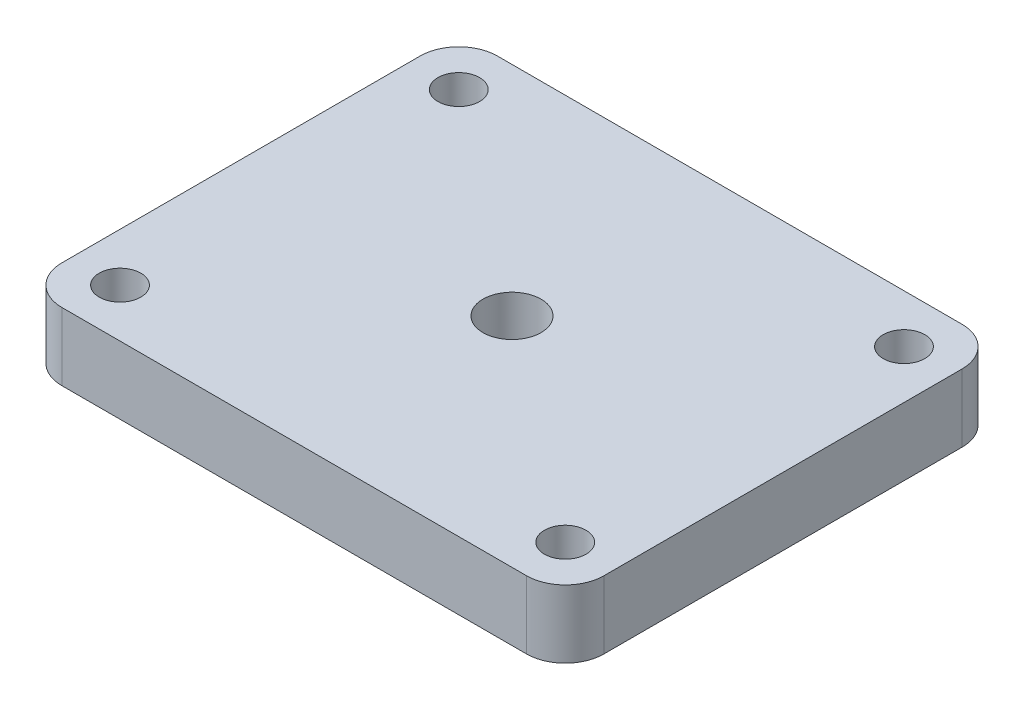
ISO-10303-21;
HEADER;
FILE_DESCRIPTION(('STEP AP214'),'2;1');
FILE_NAME('part.step','',(''),(''),'','','');
FILE_SCHEMA(('AUTOMOTIVE_DESIGN { 1 0 10303 214 1 1 1 1 }'));
ENDSEC;
DATA;
#1=APPLICATION_CONTEXT('core data for automotive mechanical design processes');
#2=APPLICATION_PROTOCOL_DEFINITION('international standard','automotive_design',2000,#1);
#3=PRODUCT_CONTEXT('',#1,'mechanical');
#4=PRODUCT('Part','Part','',(#3));
#5=PRODUCT_RELATED_PRODUCT_CATEGORY('part','',(#4));
#6=PRODUCT_DEFINITION_FORMATION('','',#4);
#7=PRODUCT_DEFINITION_CONTEXT('part definition',#1,'design');
#8=PRODUCT_DEFINITION('design','',#6,#7);
#9=PRODUCT_DEFINITION_SHAPE('','',#8);
#10=(LENGTH_UNIT() NAMED_UNIT(*) SI_UNIT(.MILLI.,.METRE.));
#11=(NAMED_UNIT(*) PLANE_ANGLE_UNIT() SI_UNIT($,.RADIAN.));
#12=(NAMED_UNIT(*) SI_UNIT($,.STERADIAN.) SOLID_ANGLE_UNIT());
#13=UNCERTAINTY_MEASURE_WITH_UNIT(LENGTH_MEASURE(1.E-05),#10,'distance_accuracy_value','');
#14=(GEOMETRIC_REPRESENTATION_CONTEXT(3) GLOBAL_UNCERTAINTY_ASSIGNED_CONTEXT((#13)) GLOBAL_UNIT_ASSIGNED_CONTEXT((#10,
#11,#12)) REPRESENTATION_CONTEXT('',''));
#15=CARTESIAN_POINT('',(0.,0.,0.));
#16=DIRECTION('',(0.,0.,1.));
#17=DIRECTION('',(1.,0.,0.));
#18=AXIS2_PLACEMENT_3D('',#15,#16,#17);
#19=CARTESIAN_POINT('',(24.,1.,-18.5));
#20=DIRECTION('',(0.,-1.,0.));
#21=DIRECTION('',(0.,0.,-1.));
#22=AXIS2_PLACEMENT_3D('',#19,#20,#21);
#23=CYLINDRICAL_SURFACE('',#22,4.);
#24=DIRECTION('',(0.,-1.,0.));
#25=VECTOR('',#24,1.);
#26=CARTESIAN_POINT('',(28.,1.,-18.5));
#27=LINE('',#26,#25);
#28=CARTESIAN_POINT('',(28.,1.,-18.5));
#29=VERTEX_POINT('',#28);
#30=CARTESIAN_POINT('',(28.,-6.,-18.5));
#31=VERTEX_POINT('',#30);
#32=EDGE_CURVE('E177',#29,#31,#27,.T.);
#33=ORIENTED_EDGE('',*,*,#32,.T.);
#34=CARTESIAN_POINT('',(24.,-6.,-18.5));
#35=DIRECTION('',(0.,-1.,0.));
#36=DIRECTION('',(0.,0.,-1.));
#37=AXIS2_PLACEMENT_3D('',#34,#35,#36);
#38=CIRCLE('',#37,4.);
#39=CARTESIAN_POINT('',(24.,-6.,-22.5));
#40=VERTEX_POINT('',#39);
#41=EDGE_CURVE('E116',#40,#31,#38,.T.);
#42=ORIENTED_EDGE('',*,*,#41,.F.);
#43=DIRECTION('',(0.,-1.,0.));
#44=VECTOR('',#43,1.);
#45=CARTESIAN_POINT('',(24.,1.,-22.5));
#46=LINE('',#45,#44);
#47=CARTESIAN_POINT('',(24.,1.,-22.5));
#48=VERTEX_POINT('',#47);
#49=EDGE_CURVE('E11',#48,#40,#46,.T.);
#50=ORIENTED_EDGE('',*,*,#49,.F.);
#51=CARTESIAN_POINT('',(24.,1.,-18.5));
#52=DIRECTION('',(0.,1.,0.));
#53=DIRECTION('',(0.,0.,1.));
#54=AXIS2_PLACEMENT_3D('',#51,#52,#53);
#55=CIRCLE('',#54,4.);
#56=EDGE_CURVE('E153',#48,#29,#55,.F.);
#57=ORIENTED_EDGE('',*,*,#56,.T.);
#58=EDGE_LOOP('',(#33,#42,#50,#57));
#59=FACE_BOUND('',#58,.T.);
#60=ADVANCED_FACE('F38',(#59),#23,.T.);
#61=CARTESIAN_POINT('',(0.,1.,-22.5));
#62=DIRECTION('',(0.,0.,-1.));
#63=DIRECTION('',(-1.,0.,0.));
#64=AXIS2_PLACEMENT_3D('',#61,#62,#63);
#65=PLANE('',#64);
#66=ORIENTED_EDGE('',*,*,#49,.T.);
#67=DIRECTION('',(1.,0.,0.));
#68=VECTOR('',#67,1.);
#69=CARTESIAN_POINT('',(-24.,-6.,-22.5));
#70=LINE('',#69,#68);
#71=CARTESIAN_POINT('',(-24.,-6.,-22.5));
#72=VERTEX_POINT('',#71);
#73=EDGE_CURVE('E111',#72,#40,#70,.T.);
#74=ORIENTED_EDGE('',*,*,#73,.F.);
#75=DIRECTION('',(0.,-1.,0.));
#76=VECTOR('',#75,1.);
#77=CARTESIAN_POINT('',(-24.,1.,-22.5));
#78=LINE('',#77,#76);
#79=CARTESIAN_POINT('',(-24.,1.,-22.5));
#80=VERTEX_POINT('',#79);
#81=EDGE_CURVE('E46',#80,#72,#78,.T.);
#82=ORIENTED_EDGE('',*,*,#81,.F.);
#83=DIRECTION('',(1.,0.,0.));
#84=VECTOR('',#83,1.);
#85=CARTESIAN_POINT('',(0.,1.,-22.5));
#86=LINE('',#85,#84);
#87=EDGE_CURVE('E156',#80,#48,#86,.T.);
#88=ORIENTED_EDGE('',*,*,#87,.T.);
#89=EDGE_LOOP('',(#66,#74,#82,#88));
#90=FACE_BOUND('',#89,.T.);
#91=ADVANCED_FACE('F112',(#90),#65,.T.);
#92=CARTESIAN_POINT('',(-24.,1.,-18.5));
#93=DIRECTION('',(0.,-1.,0.));
#94=DIRECTION('',(0.,0.,-1.));
#95=AXIS2_PLACEMENT_3D('',#92,#93,#94);
#96=CYLINDRICAL_SURFACE('',#95,4.);
#97=ORIENTED_EDGE('',*,*,#81,.T.);
#98=CARTESIAN_POINT('',(-24.,-6.,-18.5));
#99=DIRECTION('',(0.,-1.,0.));
#100=DIRECTION('',(0.,0.,-1.));
#101=AXIS2_PLACEMENT_3D('',#98,#99,#100);
#102=CIRCLE('',#101,4.);
#103=CARTESIAN_POINT('',(-28.,-6.,-18.5));
#104=VERTEX_POINT('',#103);
#105=EDGE_CURVE('E103',#104,#72,#102,.T.);
#106=ORIENTED_EDGE('',*,*,#105,.F.);
#107=DIRECTION('',(0.,-1.,0.));
#108=VECTOR('',#107,1.);
#109=CARTESIAN_POINT('',(-28.,1.,-18.5));
#110=LINE('',#109,#108);
#111=CARTESIAN_POINT('',(-28.,1.,-18.5));
#112=VERTEX_POINT('',#111);
#113=EDGE_CURVE('E109',#112,#104,#110,.T.);
#114=ORIENTED_EDGE('',*,*,#113,.F.);
#115=CARTESIAN_POINT('',(-24.,1.,-18.5));
#116=DIRECTION('',(0.,1.,0.));
#117=DIRECTION('',(0.,0.,1.));
#118=AXIS2_PLACEMENT_3D('',#115,#116,#117);
#119=CIRCLE('',#118,4.);
#120=EDGE_CURVE('E105',#112,#80,#119,.F.);
#121=ORIENTED_EDGE('',*,*,#120,.T.);
#122=EDGE_LOOP('',(#97,#106,#114,#121));
#123=FACE_BOUND('',#122,.T.);
#124=ADVANCED_FACE('F101',(#123),#96,.T.);
#125=CARTESIAN_POINT('',(-28.,1.,0.));
#126=DIRECTION('',(-1.,0.,0.));
#127=DIRECTION('',(0.,0.,1.));
#128=AXIS2_PLACEMENT_3D('',#125,#126,#127);
#129=PLANE('',#128);
#130=ORIENTED_EDGE('',*,*,#113,.T.);
#131=DIRECTION('',(0.,0.,-1.));
#132=VECTOR('',#131,1.);
#133=CARTESIAN_POINT('',(-28.,-6.,18.5));
#134=LINE('',#133,#132);
#135=CARTESIAN_POINT('',(-28.,-6.,18.5));
#136=VERTEX_POINT('',#135);
#137=EDGE_CURVE('E123',#136,#104,#134,.T.);
#138=ORIENTED_EDGE('',*,*,#137,.F.);
#139=DIRECTION('',(0.,-1.,0.));
#140=VECTOR('',#139,1.);
#141=CARTESIAN_POINT('',(-28.,1.,18.5));
#142=LINE('',#141,#140);
#143=CARTESIAN_POINT('',(-28.,1.,18.5));
#144=VERTEX_POINT('',#143);
#145=EDGE_CURVE('E185',#144,#136,#142,.T.);
#146=ORIENTED_EDGE('',*,*,#145,.F.);
#147=DIRECTION('',(0.,0.,-1.));
#148=VECTOR('',#147,1.);
#149=CARTESIAN_POINT('',(-28.,1.,0.));
#150=LINE('',#149,#148);
#151=EDGE_CURVE('E159',#144,#112,#150,.T.);
#152=ORIENTED_EDGE('',*,*,#151,.T.);
#153=EDGE_LOOP('',(#130,#138,#146,#152));
#154=FACE_BOUND('',#153,.T.);
#155=ADVANCED_FACE('F188',(#154),#129,.T.);
#156=CARTESIAN_POINT('',(-24.,1.,18.5));
#157=DIRECTION('',(0.,-1.,0.));
#158=DIRECTION('',(0.,0.,-1.));
#159=AXIS2_PLACEMENT_3D('',#156,#157,#158);
#160=CYLINDRICAL_SURFACE('',#159,4.);
#161=ORIENTED_EDGE('',*,*,#145,.T.);
#162=CARTESIAN_POINT('',(-24.,-6.,18.5));
#163=DIRECTION('',(0.,-1.,0.));
#164=DIRECTION('',(0.,0.,-1.));
#165=AXIS2_PLACEMENT_3D('',#162,#163,#164);
#166=CIRCLE('',#165,4.);
#167=CARTESIAN_POINT('',(-24.,-6.,22.5));
#168=VERTEX_POINT('',#167);
#169=EDGE_CURVE('E141',#168,#136,#166,.T.);
#170=ORIENTED_EDGE('',*,*,#169,.F.);
#171=DIRECTION('',(0.,-1.,0.));
#172=VECTOR('',#171,1.);
#173=CARTESIAN_POINT('',(-24.,1.,22.5));
#174=LINE('',#173,#172);
#175=CARTESIAN_POINT('',(-24.,1.,22.5));
#176=VERTEX_POINT('',#175);
#177=EDGE_CURVE('E183',#176,#168,#174,.T.);
#178=ORIENTED_EDGE('',*,*,#177,.F.);
#179=CARTESIAN_POINT('',(-24.,1.,18.5));
#180=DIRECTION('',(0.,1.,0.));
#181=DIRECTION('',(0.,0.,1.));
#182=AXIS2_PLACEMENT_3D('',#179,#180,#181);
#183=CIRCLE('',#182,4.);
#184=EDGE_CURVE('E162',#176,#144,#183,.F.);
#185=ORIENTED_EDGE('',*,*,#184,.T.);
#186=EDGE_LOOP('',(#161,#170,#178,#185));
#187=FACE_BOUND('',#186,.T.);
#188=ADVANCED_FACE('F207',(#187),#160,.T.);
#189=CARTESIAN_POINT('',(0.,1.,22.5));
#190=DIRECTION('',(0.,0.,-1.));
#191=DIRECTION('',(-1.,0.,0.));
#192=AXIS2_PLACEMENT_3D('',#189,#190,#191);
#193=PLANE('',#192);
#194=ORIENTED_EDGE('',*,*,#177,.T.);
#195=DIRECTION('',(-1.,0.,0.));
#196=VECTOR('',#195,1.);
#197=CARTESIAN_POINT('',(-24.,-6.,22.5));
#198=LINE('',#197,#196);
#199=CARTESIAN_POINT('',(24.,-6.,22.5));
#200=VERTEX_POINT('',#199);
#201=EDGE_CURVE('E138',#200,#168,#198,.T.);
#202=ORIENTED_EDGE('',*,*,#201,.F.);
#203=DIRECTION('',(0.,-1.,0.));
#204=VECTOR('',#203,1.);
#205=CARTESIAN_POINT('',(24.,1.,22.5));
#206=LINE('',#205,#204);
#207=CARTESIAN_POINT('',(24.,1.,22.5));
#208=VERTEX_POINT('',#207);
#209=EDGE_CURVE('E181',#208,#200,#206,.T.);
#210=ORIENTED_EDGE('',*,*,#209,.F.);
#211=DIRECTION('',(1.,0.,0.));
#212=VECTOR('',#211,1.);
#213=CARTESIAN_POINT('',(0.,1.,22.5));
#214=LINE('',#213,#212);
#215=EDGE_CURVE('E165',#176,#208,#214,.T.);
#216=ORIENTED_EDGE('',*,*,#215,.F.);
#217=EDGE_LOOP('',(#194,#202,#210,#216));
#218=FACE_BOUND('',#217,.T.);
#219=ADVANCED_FACE('F204',(#218),#193,.F.);
#220=CARTESIAN_POINT('',(24.,1.,18.5));
#221=DIRECTION('',(0.,-1.,0.));
#222=DIRECTION('',(0.,0.,-1.));
#223=AXIS2_PLACEMENT_3D('',#220,#221,#222);
#224=CYLINDRICAL_SURFACE('',#223,4.);
#225=ORIENTED_EDGE('',*,*,#209,.T.);
#226=CARTESIAN_POINT('',(24.,-6.,18.5));
#227=DIRECTION('',(0.,-1.,0.));
#228=DIRECTION('',(0.,0.,-1.));
#229=AXIS2_PLACEMENT_3D('',#226,#227,#228);
#230=CIRCLE('',#229,4.);
#231=CARTESIAN_POINT('',(28.,-6.,18.5));
#232=VERTEX_POINT('',#231);
#233=EDGE_CURVE('E135',#232,#200,#230,.T.);
#234=ORIENTED_EDGE('',*,*,#233,.F.);
#235=DIRECTION('',(0.,-1.,0.));
#236=VECTOR('',#235,1.);
#237=CARTESIAN_POINT('',(28.,1.,18.5));
#238=LINE('',#237,#236);
#239=CARTESIAN_POINT('',(28.,1.,18.5));
#240=VERTEX_POINT('',#239);
#241=EDGE_CURVE('E179',#240,#232,#238,.T.);
#242=ORIENTED_EDGE('',*,*,#241,.F.);
#243=CARTESIAN_POINT('',(24.,1.,18.5));
#244=DIRECTION('',(0.,1.,0.));
#245=DIRECTION('',(0.,0.,1.));
#246=AXIS2_PLACEMENT_3D('',#243,#244,#245);
#247=CIRCLE('',#246,4.);
#248=EDGE_CURVE('E168',#208,#240,#247,.T.);
#249=ORIENTED_EDGE('',*,*,#248,.F.);
#250=EDGE_LOOP('',(#225,#234,#242,#249));
#251=FACE_BOUND('',#250,.T.);
#252=ADVANCED_FACE('F199',(#251),#224,.T.);
#253=CARTESIAN_POINT('',(-23.,1.,-17.5));
#254=DIRECTION('',(0.,-1.,0.));
#255=DIRECTION('',(0.,0.,-1.));
#256=AXIS2_PLACEMENT_3D('',#253,#254,#255);
#257=CYLINDRICAL_SURFACE('',#256,2.15);
#258=CARTESIAN_POINT('',(-23.,1.,-17.5));
#259=DIRECTION('',(0.,1.,0.));
#260=DIRECTION('',(0.,0.,1.));
#261=AXIS2_PLACEMENT_3D('',#258,#259,#260);
#262=CIRCLE('',#261,2.15);
#263=CARTESIAN_POINT('',(-23.,1.,-15.35));
#264=VERTEX_POINT('',#263);
#265=EDGE_CURVE('E171',#264,#264,#262,.T.);
#266=ORIENTED_EDGE('',*,*,#265,.T.);
#267=EDGE_LOOP('',(#266));
#268=FACE_BOUND('',#267,.T.);
#269=CARTESIAN_POINT('',(-23.,-6.,-17.5));
#270=DIRECTION('',(0.,-1.,0.));
#271=DIRECTION('',(0.,0.,-1.));
#272=AXIS2_PLACEMENT_3D('',#269,#270,#271);
#273=CIRCLE('',#272,2.15);
#274=CARTESIAN_POINT('',(-23.,-6.,-19.65));
#275=VERTEX_POINT('',#274);
#276=EDGE_CURVE('E127',#275,#275,#273,.T.);
#277=ORIENTED_EDGE('',*,*,#276,.T.);
#278=EDGE_LOOP('',(#277));
#279=FACE_BOUND('',#278,.T.);
#280=ADVANCED_FACE('F266',(#268,#279),#257,.F.);
#281=CARTESIAN_POINT('',(28.,1.,0.));
#282=DIRECTION('',(-1.,0.,0.));
#283=DIRECTION('',(0.,0.,1.));
#284=AXIS2_PLACEMENT_3D('',#281,#282,#283);
#285=PLANE('',#284);
#286=ORIENTED_EDGE('',*,*,#241,.T.);
#287=DIRECTION('',(0.,0.,1.));
#288=VECTOR('',#287,1.);
#289=CARTESIAN_POINT('',(28.,-6.,18.5));
#290=LINE('',#289,#288);
#291=EDGE_CURVE('E132',#31,#232,#290,.T.);
#292=ORIENTED_EDGE('',*,*,#291,.F.);
#293=ORIENTED_EDGE('',*,*,#32,.F.);
#294=DIRECTION('',(0.,0.,-1.));
#295=VECTOR('',#294,1.);
#296=CARTESIAN_POINT('',(28.,1.,0.));
#297=LINE('',#296,#295);
#298=EDGE_CURVE('E53',#240,#29,#297,.T.);
#299=ORIENTED_EDGE('',*,*,#298,.F.);
#300=EDGE_LOOP('',(#286,#292,#293,#299));
#301=FACE_BOUND('',#300,.T.);
#302=ADVANCED_FACE('F196',(#301),#285,.F.);
#303=CARTESIAN_POINT('',(-23.,1.,17.5));
#304=DIRECTION('',(0.,-1.,0.));
#305=DIRECTION('',(0.,0.,-1.));
#306=AXIS2_PLACEMENT_3D('',#303,#304,#305);
#307=CYLINDRICAL_SURFACE('',#306,2.15);
#308=CARTESIAN_POINT('',(-23.,1.,17.5));
#309=DIRECTION('',(0.,1.,0.));
#310=DIRECTION('',(0.,0.,1.));
#311=AXIS2_PLACEMENT_3D('',#308,#309,#310);
#312=CIRCLE('',#311,2.15);
#313=CARTESIAN_POINT('',(-23.,1.,19.65));
#314=VERTEX_POINT('',#313);
#315=EDGE_CURVE('E150',#314,#314,#312,.T.);
#316=ORIENTED_EDGE('',*,*,#315,.T.);
#317=EDGE_LOOP('',(#316));
#318=FACE_BOUND('',#317,.T.);
#319=CARTESIAN_POINT('',(-23.,-6.,17.5));
#320=DIRECTION('',(0.,-1.,0.));
#321=DIRECTION('',(0.,0.,-1.));
#322=AXIS2_PLACEMENT_3D('',#319,#320,#321);
#323=CIRCLE('',#322,2.15);
#324=CARTESIAN_POINT('',(-23.,-6.,15.35));
#325=VERTEX_POINT('',#324);
#326=EDGE_CURVE('E124',#325,#325,#323,.T.);
#327=ORIENTED_EDGE('',*,*,#326,.T.);
#328=EDGE_LOOP('',(#327));
#329=FACE_BOUND('',#328,.T.);
#330=ADVANCED_FACE('F224',(#318,#329),#307,.F.);
#331=CARTESIAN_POINT('',(23.,1.,-17.5));
#332=DIRECTION('',(0.,-1.,0.));
#333=DIRECTION('',(0.,0.,-1.));
#334=AXIS2_PLACEMENT_3D('',#331,#332,#333);
#335=CYLINDRICAL_SURFACE('',#334,2.15);
#336=CARTESIAN_POINT('',(23.,1.,-17.5));
#337=DIRECTION('',(0.,1.,0.));
#338=DIRECTION('',(0.,0.,1.));
#339=AXIS2_PLACEMENT_3D('',#336,#337,#338);
#340=CIRCLE('',#339,2.15);
#341=CARTESIAN_POINT('',(23.,1.,-15.35));
#342=VERTEX_POINT('',#341);
#343=EDGE_CURVE('E147',#342,#342,#340,.T.);
#344=ORIENTED_EDGE('',*,*,#343,.T.);
#345=EDGE_LOOP('',(#344));
#346=FACE_BOUND('',#345,.T.);
#347=CARTESIAN_POINT('',(23.,-6.,-17.5));
#348=DIRECTION('',(0.,-1.,0.));
#349=DIRECTION('',(0.,0.,-1.));
#350=AXIS2_PLACEMENT_3D('',#347,#348,#349);
#351=CIRCLE('',#350,2.15);
#352=CARTESIAN_POINT('',(23.,-6.,-19.65));
#353=VERTEX_POINT('',#352);
#354=EDGE_CURVE('E239',#353,#353,#351,.T.);
#355=ORIENTED_EDGE('',*,*,#354,.T.);
#356=EDGE_LOOP('',(#355));
#357=FACE_BOUND('',#356,.T.);
#358=ADVANCED_FACE('F226',(#346,#357),#335,.F.);
#359=CARTESIAN_POINT('',(23.,1.,17.5));
#360=DIRECTION('',(0.,-1.,0.));
#361=DIRECTION('',(0.,0.,-1.));
#362=AXIS2_PLACEMENT_3D('',#359,#360,#361);
#363=CYLINDRICAL_SURFACE('',#362,2.15);
#364=CARTESIAN_POINT('',(23.,1.,17.5));
#365=DIRECTION('',(0.,1.,0.));
#366=DIRECTION('',(0.,0.,1.));
#367=AXIS2_PLACEMENT_3D('',#364,#365,#366);
#368=CIRCLE('',#367,2.15);
#369=CARTESIAN_POINT('',(23.,1.,19.65));
#370=VERTEX_POINT('',#369);
#371=EDGE_CURVE('E144',#370,#370,#368,.T.);
#372=ORIENTED_EDGE('',*,*,#371,.T.);
#373=EDGE_LOOP('',(#372));
#374=FACE_BOUND('',#373,.T.);
#375=CARTESIAN_POINT('',(23.,-6.,17.5));
#376=DIRECTION('',(0.,-1.,0.));
#377=DIRECTION('',(0.,0.,-1.));
#378=AXIS2_PLACEMENT_3D('',#375,#376,#377);
#379=CIRCLE('',#378,2.15);
#380=CARTESIAN_POINT('',(23.,-6.,15.35));
#381=VERTEX_POINT('',#380);
#382=EDGE_CURVE('E241',#381,#381,#379,.T.);
#383=ORIENTED_EDGE('',*,*,#382,.T.);
#384=EDGE_LOOP('',(#383));
#385=FACE_BOUND('',#384,.T.);
#386=ADVANCED_FACE('F40',(#374,#385),#363,.F.);
#387=CARTESIAN_POINT('',(0.,1.,0.));
#388=DIRECTION('',(0.,-1.,0.));
#389=DIRECTION('',(0.,0.,-1.));
#390=AXIS2_PLACEMENT_3D('',#387,#388,#389);
#391=CYLINDRICAL_SURFACE('',#390,3.);
#392=CARTESIAN_POINT('',(0.,1.,0.));
#393=DIRECTION('',(0.,1.,0.));
#394=DIRECTION('',(0.,0.,1.));
#395=AXIS2_PLACEMENT_3D('',#392,#393,#394);
#396=CIRCLE('',#395,3.);
#397=CARTESIAN_POINT('',(0.,1.,3.));
#398=VERTEX_POINT('',#397);
#399=EDGE_CURVE('E174',#398,#398,#396,.T.);
#400=ORIENTED_EDGE('',*,*,#399,.T.);
#401=EDGE_LOOP('',(#400));
#402=FACE_BOUND('',#401,.T.);
#403=CARTESIAN_POINT('',(0.,-6.,0.));
#404=DIRECTION('',(0.,-1.,0.));
#405=DIRECTION('',(0.,0.,-1.));
#406=AXIS2_PLACEMENT_3D('',#403,#404,#405);
#407=CIRCLE('',#406,3.);
#408=CARTESIAN_POINT('',(0.,-6.,-3.));
#409=VERTEX_POINT('',#408);
#410=EDGE_CURVE('E245',#409,#409,#407,.T.);
#411=ORIENTED_EDGE('',*,*,#410,.T.);
#412=EDGE_LOOP('',(#411));
#413=FACE_BOUND('',#412,.T.);
#414=ADVANCED_FACE('F233',(#402,#413),#391,.F.);
#415=CARTESIAN_POINT('',(0.,1.,0.));
#416=DIRECTION('',(0.,1.,0.));
#417=DIRECTION('',(0.,0.,1.));
#418=AXIS2_PLACEMENT_3D('',#415,#416,#417);
#419=PLANE('',#418);
#420=ORIENTED_EDGE('',*,*,#371,.F.);
#421=EDGE_LOOP('',(#420));
#422=FACE_BOUND('',#421,.T.);
#423=ORIENTED_EDGE('',*,*,#343,.F.);
#424=EDGE_LOOP('',(#423));
#425=FACE_BOUND('',#424,.T.);
#426=ORIENTED_EDGE('',*,*,#315,.F.);
#427=EDGE_LOOP('',(#426));
#428=FACE_BOUND('',#427,.T.);
#429=ORIENTED_EDGE('',*,*,#56,.F.);
#430=ORIENTED_EDGE('',*,*,#87,.F.);
#431=ORIENTED_EDGE('',*,*,#120,.F.);
#432=ORIENTED_EDGE('',*,*,#151,.F.);
#433=ORIENTED_EDGE('',*,*,#184,.F.);
#434=ORIENTED_EDGE('',*,*,#215,.T.);
#435=ORIENTED_EDGE('',*,*,#248,.T.);
#436=ORIENTED_EDGE('',*,*,#298,.T.);
#437=EDGE_LOOP('',(#429,#430,#431,#432,#433,#434,#435,#436));
#438=FACE_BOUND('',#437,.T.);
#439=ORIENTED_EDGE('',*,*,#265,.F.);
#440=EDGE_LOOP('',(#439));
#441=FACE_BOUND('',#440,.T.);
#442=ORIENTED_EDGE('',*,*,#399,.F.);
#443=EDGE_LOOP('',(#442));
#444=FACE_BOUND('',#443,.T.);
#445=ADVANCED_FACE('F190',(#422,#425,#428,#438,#441,#444),#419,.T.);
#446=CARTESIAN_POINT('',(-24.,-6.,-18.5));
#447=DIRECTION('',(0.,-1.,0.));
#448=DIRECTION('',(0.,0.,-1.));
#449=AXIS2_PLACEMENT_3D('',#446,#447,#448);
#450=PLANE('',#449);
#451=ORIENTED_EDGE('',*,*,#382,.F.);
#452=EDGE_LOOP('',(#451));
#453=FACE_BOUND('',#452,.T.);
#454=ORIENTED_EDGE('',*,*,#276,.F.);
#455=EDGE_LOOP('',(#454));
#456=FACE_BOUND('',#455,.T.);
#457=ORIENTED_EDGE('',*,*,#105,.T.);
#458=ORIENTED_EDGE('',*,*,#73,.T.);
#459=ORIENTED_EDGE('',*,*,#41,.T.);
#460=ORIENTED_EDGE('',*,*,#291,.T.);
#461=ORIENTED_EDGE('',*,*,#233,.T.);
#462=ORIENTED_EDGE('',*,*,#201,.T.);
#463=ORIENTED_EDGE('',*,*,#169,.T.);
#464=ORIENTED_EDGE('',*,*,#137,.T.);
#465=EDGE_LOOP('',(#457,#458,#459,#460,#461,#462,#463,#464));
#466=FACE_BOUND('',#465,.T.);
#467=ORIENTED_EDGE('',*,*,#326,.F.);
#468=EDGE_LOOP('',(#467));
#469=FACE_BOUND('',#468,.T.);
#470=ORIENTED_EDGE('',*,*,#354,.F.);
#471=EDGE_LOOP('',(#470));
#472=FACE_BOUND('',#471,.T.);
#473=ORIENTED_EDGE('',*,*,#410,.F.);
#474=EDGE_LOOP('',(#473));
#475=FACE_BOUND('',#474,.T.);
#476=ADVANCED_FACE('F119',(#453,#456,#466,#469,#472,#475),#450,.T.);
#477=CLOSED_SHELL('',(#60,#91,#124,#155,#188,#219,#252,#280,#302,#330,#358,#386,#414,#445,#476));
#478=MANIFOLD_SOLID_BREP('B2',#477);
#479=ADVANCED_BREP_SHAPE_REPRESENTATION('',(#18,#478),#14);
#480=SHAPE_DEFINITION_REPRESENTATION(#9,#479);
ENDSEC;
END-ISO-10303-21;
